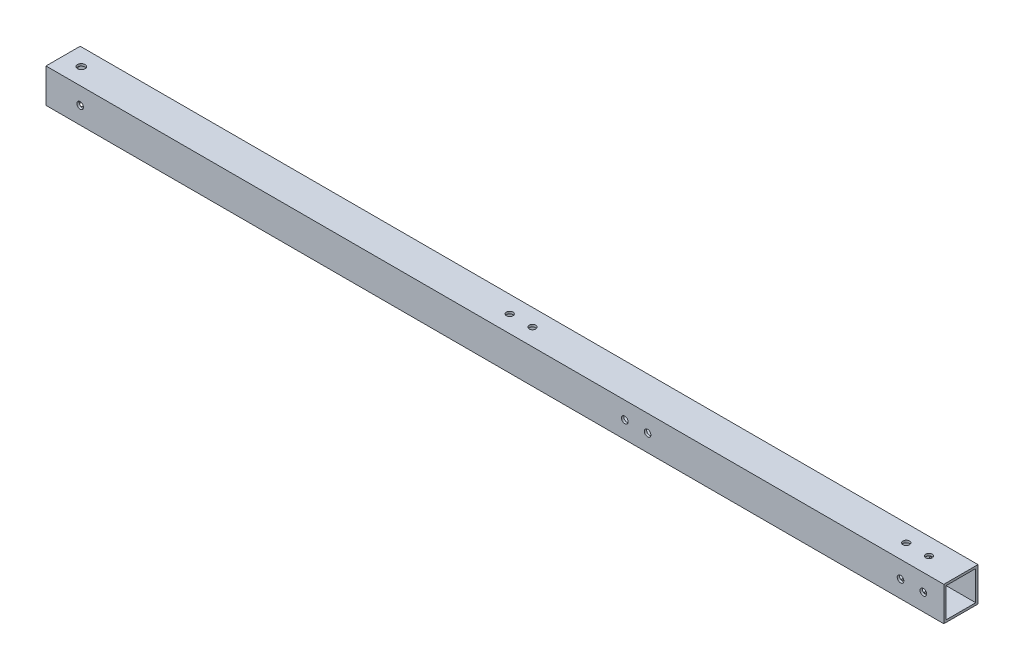
ISO-10303-21;
HEADER;
FILE_DESCRIPTION(('STEP AP214'),'2;1');
FILE_NAME('part.step','',(''),(''),'','','');
FILE_SCHEMA(('AUTOMOTIVE_DESIGN { 1 0 10303 214 1 1 1 1 }'));
ENDSEC;
DATA;
#1=APPLICATION_CONTEXT('core data for automotive mechanical design processes');
#2=APPLICATION_PROTOCOL_DEFINITION('international standard','automotive_design',2000,#1);
#3=PRODUCT_CONTEXT('',#1,'mechanical');
#4=PRODUCT('Part','Part','',(#3));
#5=PRODUCT_RELATED_PRODUCT_CATEGORY('part','',(#4));
#6=PRODUCT_DEFINITION_FORMATION('','',#4);
#7=PRODUCT_DEFINITION_CONTEXT('part definition',#1,'design');
#8=PRODUCT_DEFINITION('design','',#6,#7);
#9=PRODUCT_DEFINITION_SHAPE('','',#8);
#10=(LENGTH_UNIT() NAMED_UNIT(*) SI_UNIT(.MILLI.,.METRE.));
#11=(NAMED_UNIT(*) PLANE_ANGLE_UNIT() SI_UNIT($,.RADIAN.));
#12=(NAMED_UNIT(*) SI_UNIT($,.STERADIAN.) SOLID_ANGLE_UNIT());
#13=UNCERTAINTY_MEASURE_WITH_UNIT(LENGTH_MEASURE(1.E-05),#10,'distance_accuracy_value','');
#14=(GEOMETRIC_REPRESENTATION_CONTEXT(3) GLOBAL_UNCERTAINTY_ASSIGNED_CONTEXT((#13)) GLOBAL_UNIT_ASSIGNED_CONTEXT((#10,
#11,#12)) REPRESENTATION_CONTEXT('',''));
#15=CARTESIAN_POINT('',(0.,0.,0.));
#16=DIRECTION('',(0.,0.,1.));
#17=DIRECTION('',(1.,0.,0.));
#18=AXIS2_PLACEMENT_3D('',#15,#16,#17);
#19=CARTESIAN_POINT('',(394.,0.,0.));
#20=DIRECTION('',(-1.,0.,0.));
#21=DIRECTION('',(0.,0.,1.));
#22=AXIS2_PLACEMENT_3D('',#19,#20,#21);
#23=PLANE('',#22);
#24=DIRECTION('',(0.,1.,0.));
#25=VECTOR('',#24,1.);
#26=CARTESIAN_POINT('',(394.,-7.5,-7.5));
#27=LINE('',#26,#25);
#28=CARTESIAN_POINT('',(394.,-7.5,-7.5));
#29=VERTEX_POINT('',#28);
#30=CARTESIAN_POINT('',(394.,7.5,-7.5));
#31=VERTEX_POINT('',#30);
#32=EDGE_CURVE('E146',#29,#31,#27,.T.);
#33=ORIENTED_EDGE('',*,*,#32,.T.);
#34=DIRECTION('',(0.,0.,1.));
#35=VECTOR('',#34,1.);
#36=CARTESIAN_POINT('',(394.,7.5,7.5));
#37=LINE('',#36,#35);
#38=CARTESIAN_POINT('',(394.,7.5,7.5));
#39=VERTEX_POINT('',#38);
#40=EDGE_CURVE('E149',#31,#39,#37,.T.);
#41=ORIENTED_EDGE('',*,*,#40,.T.);
#42=DIRECTION('',(0.,-1.,0.));
#43=VECTOR('',#42,1.);
#44=CARTESIAN_POINT('',(394.,-7.5,7.5));
#45=LINE('',#44,#43);
#46=CARTESIAN_POINT('',(394.,-7.5,7.5));
#47=VERTEX_POINT('',#46);
#48=EDGE_CURVE('E152',#39,#47,#45,.T.);
#49=ORIENTED_EDGE('',*,*,#48,.T.);
#50=DIRECTION('',(0.,0.,-1.));
#51=VECTOR('',#50,1.);
#52=CARTESIAN_POINT('',(394.,-7.5,7.5));
#53=LINE('',#52,#51);
#54=EDGE_CURVE('E154',#47,#29,#53,.T.);
#55=ORIENTED_EDGE('',*,*,#54,.T.);
#56=EDGE_LOOP('',(#33,#41,#49,#55));
#57=FACE_BOUND('',#56,.T.);
#58=DIRECTION('',(0.,0.,-1.));
#59=VECTOR('',#58,1.);
#60=CARTESIAN_POINT('',(394.,-6.5,6.5));
#61=LINE('',#60,#59);
#62=CARTESIAN_POINT('',(394.,-6.5,6.5));
#63=VERTEX_POINT('',#62);
#64=CARTESIAN_POINT('',(394.,-6.5,-6.5));
#65=VERTEX_POINT('',#64);
#66=EDGE_CURVE('E108',#63,#65,#61,.T.);
#67=ORIENTED_EDGE('',*,*,#66,.F.);
#68=DIRECTION('',(0.,-1.,0.));
#69=VECTOR('',#68,1.);
#70=CARTESIAN_POINT('',(394.,-6.5,6.5));
#71=LINE('',#70,#69);
#72=CARTESIAN_POINT('',(394.,6.5,6.5));
#73=VERTEX_POINT('',#72);
#74=EDGE_CURVE('E130',#73,#63,#71,.T.);
#75=ORIENTED_EDGE('',*,*,#74,.F.);
#76=DIRECTION('',(0.,0.,1.));
#77=VECTOR('',#76,1.);
#78=CARTESIAN_POINT('',(394.,6.5,6.5));
#79=LINE('',#78,#77);
#80=CARTESIAN_POINT('',(394.,6.5,-6.5));
#81=VERTEX_POINT('',#80);
#82=EDGE_CURVE('E128',#81,#73,#79,.T.);
#83=ORIENTED_EDGE('',*,*,#82,.F.);
#84=DIRECTION('',(0.,1.,0.));
#85=VECTOR('',#84,1.);
#86=CARTESIAN_POINT('',(394.,-6.5,-6.5));
#87=LINE('',#86,#85);
#88=EDGE_CURVE('E116',#65,#81,#87,.T.);
#89=ORIENTED_EDGE('',*,*,#88,.F.);
#90=EDGE_LOOP('',(#67,#75,#83,#89));
#91=FACE_BOUND('',#90,.T.);
#92=ADVANCED_FACE('F41',(#57,#91),#23,.F.);
#93=CARTESIAN_POINT('',(0.,0.,0.));
#94=DIRECTION('',(-1.,0.,0.));
#95=DIRECTION('',(0.,0.,1.));
#96=AXIS2_PLACEMENT_3D('',#93,#94,#95);
#97=PLANE('',#96);
#98=DIRECTION('',(0.,1.,0.));
#99=VECTOR('',#98,1.);
#100=CARTESIAN_POINT('',(0.,-7.5,-7.5));
#101=LINE('',#100,#99);
#102=CARTESIAN_POINT('',(0.,-7.5,-7.5));
#103=VERTEX_POINT('',#102);
#104=CARTESIAN_POINT('',(0.,7.5,-7.5));
#105=VERTEX_POINT('',#104);
#106=EDGE_CURVE('E124',#103,#105,#101,.T.);
#107=ORIENTED_EDGE('',*,*,#106,.F.);
#108=DIRECTION('',(0.,0.,-1.));
#109=VECTOR('',#108,1.);
#110=CARTESIAN_POINT('',(0.,-7.5,7.5));
#111=LINE('',#110,#109);
#112=CARTESIAN_POINT('',(0.,-7.5,7.5));
#113=VERTEX_POINT('',#112);
#114=EDGE_CURVE('E150',#113,#103,#111,.T.);
#115=ORIENTED_EDGE('',*,*,#114,.F.);
#116=DIRECTION('',(0.,-1.,0.));
#117=VECTOR('',#116,1.);
#118=CARTESIAN_POINT('',(0.,-7.5,7.5));
#119=LINE('',#118,#117);
#120=CARTESIAN_POINT('',(0.,7.5,7.5));
#121=VERTEX_POINT('',#120);
#122=EDGE_CURVE('E161',#121,#113,#119,.T.);
#123=ORIENTED_EDGE('',*,*,#122,.F.);
#124=DIRECTION('',(0.,0.,1.));
#125=VECTOR('',#124,1.);
#126=CARTESIAN_POINT('',(0.,7.5,7.5));
#127=LINE('',#126,#125);
#128=EDGE_CURVE('E159',#105,#121,#127,.T.);
#129=ORIENTED_EDGE('',*,*,#128,.F.);
#130=EDGE_LOOP('',(#107,#115,#123,#129));
#131=FACE_BOUND('',#130,.T.);
#132=DIRECTION('',(0.,-1.,0.));
#133=VECTOR('',#132,1.);
#134=CARTESIAN_POINT('',(0.,-6.5,6.5));
#135=LINE('',#134,#133);
#136=CARTESIAN_POINT('',(0.,6.5,6.5));
#137=VERTEX_POINT('',#136);
#138=CARTESIAN_POINT('',(0.,-6.5,6.5));
#139=VERTEX_POINT('',#138);
#140=EDGE_CURVE('E117',#137,#139,#135,.T.);
#141=ORIENTED_EDGE('',*,*,#140,.T.);
#142=DIRECTION('',(0.,0.,-1.));
#143=VECTOR('',#142,1.);
#144=CARTESIAN_POINT('',(0.,-6.5,6.5));
#145=LINE('',#144,#143);
#146=CARTESIAN_POINT('',(0.,-6.5,-6.5));
#147=VERTEX_POINT('',#146);
#148=EDGE_CURVE('E66',#139,#147,#145,.T.);
#149=ORIENTED_EDGE('',*,*,#148,.T.);
#150=DIRECTION('',(0.,1.,0.));
#151=VECTOR('',#150,1.);
#152=CARTESIAN_POINT('',(0.,-6.5,-6.5));
#153=LINE('',#152,#151);
#154=CARTESIAN_POINT('',(0.,6.5,-6.5));
#155=VERTEX_POINT('',#154);
#156=EDGE_CURVE('E123',#147,#155,#153,.T.);
#157=ORIENTED_EDGE('',*,*,#156,.T.);
#158=DIRECTION('',(0.,0.,1.));
#159=VECTOR('',#158,1.);
#160=CARTESIAN_POINT('',(0.,6.5,6.5));
#161=LINE('',#160,#159);
#162=EDGE_CURVE('E138',#155,#137,#161,.T.);
#163=ORIENTED_EDGE('',*,*,#162,.T.);
#164=EDGE_LOOP('',(#141,#149,#157,#163));
#165=FACE_BOUND('',#164,.T.);
#166=ADVANCED_FACE('F298',(#131,#165),#97,.T.);
#167=CARTESIAN_POINT('',(394.,-7.5,-7.5));
#168=DIRECTION('',(0.,0.,1.));
#169=DIRECTION('',(1.,0.,0.));
#170=AXIS2_PLACEMENT_3D('',#167,#168,#169);
#171=PLANE('',#170);
#172=CARTESIAN_POINT('',(15.0000000000045,0.,-7.5));
#173=DIRECTION('',(0.,0.,1.));
#174=DIRECTION('',(1.,0.,0.));
#175=AXIS2_PLACEMENT_3D('',#172,#173,#174);
#176=CIRCLE('',#175,1.4499999999957);
#177=CARTESIAN_POINT('',(16.4500000000002,0.,-7.5));
#178=VERTEX_POINT('',#177);
#179=EDGE_CURVE('E414',#178,#178,#176,.T.);
#180=ORIENTED_EDGE('',*,*,#179,.T.);
#181=EDGE_LOOP('',(#180));
#182=FACE_BOUND('',#181,.T.);
#183=CARTESIAN_POINT('',(254.,6.66133814775094E-13,-7.5));
#184=DIRECTION('',(0.,0.,1.));
#185=DIRECTION('',(1.,0.,0.));
#186=AXIS2_PLACEMENT_3D('',#183,#184,#185);
#187=CIRCLE('',#186,1.45000000000084);
#188=CARTESIAN_POINT('',(255.450000000001,6.66133814775094E-13,-7.5));
#189=VERTEX_POINT('',#188);
#190=EDGE_CURVE('E408',#189,#189,#187,.T.);
#191=ORIENTED_EDGE('',*,*,#190,.T.);
#192=EDGE_LOOP('',(#191));
#193=FACE_BOUND('',#192,.T.);
#194=CARTESIAN_POINT('',(264.,5.55111512312578E-13,-7.5));
#195=DIRECTION('',(0.,0.,1.));
#196=DIRECTION('',(1.,0.,0.));
#197=AXIS2_PLACEMENT_3D('',#194,#195,#196);
#198=CIRCLE('',#197,1.45000000000084);
#199=CARTESIAN_POINT('',(265.450000000001,5.55111512312578E-13,-7.5));
#200=VERTEX_POINT('',#199);
#201=EDGE_CURVE('E400',#200,#200,#198,.T.);
#202=ORIENTED_EDGE('',*,*,#201,.T.);
#203=EDGE_LOOP('',(#202));
#204=FACE_BOUND('',#203,.T.);
#205=CARTESIAN_POINT('',(385.,0.,-7.5));
#206=DIRECTION('',(0.,0.,1.));
#207=DIRECTION('',(1.,0.,0.));
#208=AXIS2_PLACEMENT_3D('',#205,#206,#207);
#209=CIRCLE('',#208,1.44999999999994);
#210=CARTESIAN_POINT('',(386.45,0.,-7.5));
#211=VERTEX_POINT('',#210);
#212=EDGE_CURVE('E391',#211,#211,#209,.T.);
#213=ORIENTED_EDGE('',*,*,#212,.T.);
#214=EDGE_LOOP('',(#213));
#215=FACE_BOUND('',#214,.T.);
#216=CARTESIAN_POINT('',(375.,0.,-7.5));
#217=DIRECTION('',(0.,0.,1.));
#218=DIRECTION('',(1.,0.,0.));
#219=AXIS2_PLACEMENT_3D('',#216,#217,#218);
#220=CIRCLE('',#219,1.44999999999994);
#221=CARTESIAN_POINT('',(376.45,0.,-7.5));
#222=VERTEX_POINT('',#221);
#223=EDGE_CURVE('E195',#222,#222,#220,.T.);
#224=ORIENTED_EDGE('',*,*,#223,.T.);
#225=EDGE_LOOP('',(#224));
#226=FACE_BOUND('',#225,.T.);
#227=ORIENTED_EDGE('',*,*,#106,.T.);
#228=DIRECTION('',(-1.,0.,0.));
#229=VECTOR('',#228,1.);
#230=CARTESIAN_POINT('',(394.,7.5,-7.5));
#231=LINE('',#230,#229);
#232=EDGE_CURVE('E11',#31,#105,#231,.T.);
#233=ORIENTED_EDGE('',*,*,#232,.F.);
#234=ORIENTED_EDGE('',*,*,#32,.F.);
#235=DIRECTION('',(-1.,0.,0.));
#236=VECTOR('',#235,1.);
#237=CARTESIAN_POINT('',(394.,-7.5,-7.5));
#238=LINE('',#237,#236);
#239=EDGE_CURVE('E156',#29,#103,#238,.T.);
#240=ORIENTED_EDGE('',*,*,#239,.T.);
#241=EDGE_LOOP('',(#227,#233,#234,#240));
#242=FACE_BOUND('',#241,.T.);
#243=ADVANCED_FACE('F43',(#182,#193,#204,#215,#226,#242),#171,.F.);
#244=CARTESIAN_POINT('',(394.,7.5,7.5));
#245=DIRECTION('',(0.,-1.,0.));
#246=DIRECTION('',(0.,0.,-1.));
#247=AXIS2_PLACEMENT_3D('',#244,#245,#246);
#248=PLANE('',#247);
#249=CARTESIAN_POINT('',(8.00000000000494,7.5,0.));
#250=DIRECTION('',(0.,1.,0.));
#251=DIRECTION('',(0.,0.,1.));
#252=AXIS2_PLACEMENT_3D('',#249,#250,#251);
#253=CIRCLE('',#252,1.65);
#254=CARTESIAN_POINT('',(8.00000000000494,7.5,1.64999999999998));
#255=VERTEX_POINT('',#254);
#256=EDGE_CURVE('E223',#255,#255,#253,.T.);
#257=ORIENTED_EDGE('',*,*,#256,.F.);
#258=EDGE_LOOP('',(#257));
#259=FACE_BOUND('',#258,.T.);
#260=CARTESIAN_POINT('',(380.,7.5,0.));
#261=DIRECTION('',(0.,1.,0.));
#262=DIRECTION('',(0.,0.,1.));
#263=AXIS2_PLACEMENT_3D('',#260,#261,#262);
#264=CIRCLE('',#263,1.45);
#265=CARTESIAN_POINT('',(380.,7.5,1.45));
#266=VERTEX_POINT('',#265);
#267=EDGE_CURVE('E226',#266,#266,#264,.T.);
#268=ORIENTED_EDGE('',*,*,#267,.F.);
#269=EDGE_LOOP('',(#268));
#270=FACE_BOUND('',#269,.T.);
#271=CARTESIAN_POINT('',(370.,7.5,0.));
#272=DIRECTION('',(0.,1.,0.));
#273=DIRECTION('',(0.,0.,1.));
#274=AXIS2_PLACEMENT_3D('',#271,#272,#273);
#275=CIRCLE('',#274,1.45);
#276=CARTESIAN_POINT('',(370.,7.5,1.45));
#277=VERTEX_POINT('',#276);
#278=EDGE_CURVE('E232',#277,#277,#275,.T.);
#279=ORIENTED_EDGE('',*,*,#278,.F.);
#280=EDGE_LOOP('',(#279));
#281=FACE_BOUND('',#280,.T.);
#282=CARTESIAN_POINT('',(196.000000000002,7.5,-1.17961196366423E-11));
#283=DIRECTION('',(0.,1.,0.));
#284=DIRECTION('',(0.,0.,1.));
#285=AXIS2_PLACEMENT_3D('',#282,#283,#284);
#286=CIRCLE('',#285,1.44999999999739);
#287=CARTESIAN_POINT('',(196.000000000002,7.5,1.44999999998559));
#288=VERTEX_POINT('',#287);
#289=EDGE_CURVE('E238',#288,#288,#286,.T.);
#290=ORIENTED_EDGE('',*,*,#289,.F.);
#291=EDGE_LOOP('',(#290));
#292=FACE_BOUND('',#291,.T.);
#293=CARTESIAN_POINT('',(206.000000000002,7.5,-1.14352971536391E-11));
#294=DIRECTION('',(0.,1.,0.));
#295=DIRECTION('',(0.,0.,1.));
#296=AXIS2_PLACEMENT_3D('',#293,#294,#295);
#297=CIRCLE('',#296,1.44999999999739);
#298=CARTESIAN_POINT('',(206.000000000002,7.5,1.44999999998595));
#299=VERTEX_POINT('',#298);
#300=EDGE_CURVE('E244',#299,#299,#297,.T.);
#301=ORIENTED_EDGE('',*,*,#300,.F.);
#302=EDGE_LOOP('',(#301));
#303=FACE_BOUND('',#302,.T.);
#304=ORIENTED_EDGE('',*,*,#128,.T.);
#305=DIRECTION('',(-1.,0.,0.));
#306=VECTOR('',#305,1.);
#307=CARTESIAN_POINT('',(394.,7.5,7.5));
#308=LINE('',#307,#306);
#309=EDGE_CURVE('E50',#39,#121,#308,.T.);
#310=ORIENTED_EDGE('',*,*,#309,.F.);
#311=ORIENTED_EDGE('',*,*,#40,.F.);
#312=ORIENTED_EDGE('',*,*,#232,.T.);
#313=EDGE_LOOP('',(#304,#310,#311,#312));
#314=FACE_BOUND('',#313,.T.);
#315=ADVANCED_FACE('F302',(#259,#270,#281,#292,#303,#314),#248,.F.);
#316=CARTESIAN_POINT('',(394.,-7.5,7.5));
#317=DIRECTION('',(0.,0.,-1.));
#318=DIRECTION('',(-1.,0.,0.));
#319=AXIS2_PLACEMENT_3D('',#316,#317,#318);
#320=PLANE('',#319);
#321=CARTESIAN_POINT('',(15.0000000000045,0.,7.5));
#322=DIRECTION('',(0.,0.,1.));
#323=DIRECTION('',(1.,0.,0.));
#324=AXIS2_PLACEMENT_3D('',#321,#322,#323);
#325=CIRCLE('',#324,1.4499999999957);
#326=CARTESIAN_POINT('',(16.4500000000002,0.,7.5));
#327=VERTEX_POINT('',#326);
#328=EDGE_CURVE('E411',#327,#327,#325,.T.);
#329=ORIENTED_EDGE('',*,*,#328,.F.);
#330=EDGE_LOOP('',(#329));
#331=FACE_BOUND('',#330,.T.);
#332=CARTESIAN_POINT('',(254.,6.66133814775094E-13,7.5));
#333=DIRECTION('',(0.,0.,1.));
#334=DIRECTION('',(1.,0.,0.));
#335=AXIS2_PLACEMENT_3D('',#332,#333,#334);
#336=CIRCLE('',#335,1.45000000000084);
#337=CARTESIAN_POINT('',(255.450000000001,6.66133814775094E-13,7.5));
#338=VERTEX_POINT('',#337);
#339=EDGE_CURVE('E405',#338,#338,#336,.T.);
#340=ORIENTED_EDGE('',*,*,#339,.F.);
#341=EDGE_LOOP('',(#340));
#342=FACE_BOUND('',#341,.T.);
#343=CARTESIAN_POINT('',(264.,5.55111512312578E-13,7.5));
#344=DIRECTION('',(0.,0.,1.));
#345=DIRECTION('',(1.,0.,0.));
#346=AXIS2_PLACEMENT_3D('',#343,#344,#345);
#347=CIRCLE('',#346,1.45000000000084);
#348=CARTESIAN_POINT('',(265.450000000001,5.55111512312578E-13,7.5));
#349=VERTEX_POINT('',#348);
#350=EDGE_CURVE('E394',#349,#349,#347,.T.);
#351=ORIENTED_EDGE('',*,*,#350,.F.);
#352=EDGE_LOOP('',(#351));
#353=FACE_BOUND('',#352,.T.);
#354=CARTESIAN_POINT('',(385.,0.,7.5));
#355=DIRECTION('',(0.,0.,1.));
#356=DIRECTION('',(1.,0.,0.));
#357=AXIS2_PLACEMENT_3D('',#354,#355,#356);
#358=CIRCLE('',#357,1.44999999999994);
#359=CARTESIAN_POINT('',(386.45,0.,7.5));
#360=VERTEX_POINT('',#359);
#361=EDGE_CURVE('E393',#360,#360,#358,.T.);
#362=ORIENTED_EDGE('',*,*,#361,.F.);
#363=EDGE_LOOP('',(#362));
#364=FACE_BOUND('',#363,.T.);
#365=CARTESIAN_POINT('',(375.,0.,7.5));
#366=DIRECTION('',(0.,0.,1.));
#367=DIRECTION('',(1.,0.,0.));
#368=AXIS2_PLACEMENT_3D('',#365,#366,#367);
#369=CIRCLE('',#368,1.44999999999994);
#370=CARTESIAN_POINT('',(376.45,0.,7.5));
#371=VERTEX_POINT('',#370);
#372=EDGE_CURVE('E397',#371,#371,#369,.T.);
#373=ORIENTED_EDGE('',*,*,#372,.F.);
#374=EDGE_LOOP('',(#373));
#375=FACE_BOUND('',#374,.T.);
#376=ORIENTED_EDGE('',*,*,#122,.T.);
#377=DIRECTION('',(-1.,0.,0.));
#378=VECTOR('',#377,1.);
#379=CARTESIAN_POINT('',(394.,-7.5,7.5));
#380=LINE('',#379,#378);
#381=EDGE_CURVE('E166',#47,#113,#380,.T.);
#382=ORIENTED_EDGE('',*,*,#381,.F.);
#383=ORIENTED_EDGE('',*,*,#48,.F.);
#384=ORIENTED_EDGE('',*,*,#309,.T.);
#385=EDGE_LOOP('',(#376,#382,#383,#384));
#386=FACE_BOUND('',#385,.T.);
#387=ADVANCED_FACE('F285',(#331,#342,#353,#364,#375,#386),#320,.F.);
#388=CARTESIAN_POINT('',(394.,-7.5,7.5));
#389=DIRECTION('',(0.,1.,0.));
#390=DIRECTION('',(0.,0.,1.));
#391=AXIS2_PLACEMENT_3D('',#388,#389,#390);
#392=PLANE('',#391);
#393=CARTESIAN_POINT('',(8.00000000000494,-7.5,0.));
#394=DIRECTION('',(0.,1.,0.));
#395=DIRECTION('',(0.,0.,1.));
#396=AXIS2_PLACEMENT_3D('',#393,#394,#395);
#397=CIRCLE('',#396,1.65);
#398=CARTESIAN_POINT('',(8.00000000000494,-7.5,1.64999999999998));
#399=VERTEX_POINT('',#398);
#400=EDGE_CURVE('E175',#399,#399,#397,.T.);
#401=ORIENTED_EDGE('',*,*,#400,.T.);
#402=EDGE_LOOP('',(#401));
#403=FACE_BOUND('',#402,.T.);
#404=CARTESIAN_POINT('',(380.,-7.5,0.));
#405=DIRECTION('',(0.,1.,0.));
#406=DIRECTION('',(0.,0.,1.));
#407=AXIS2_PLACEMENT_3D('',#404,#405,#406);
#408=CIRCLE('',#407,1.45);
#409=CARTESIAN_POINT('',(380.,-7.5,1.45));
#410=VERTEX_POINT('',#409);
#411=EDGE_CURVE('E229',#410,#410,#408,.T.);
#412=ORIENTED_EDGE('',*,*,#411,.T.);
#413=EDGE_LOOP('',(#412));
#414=FACE_BOUND('',#413,.T.);
#415=CARTESIAN_POINT('',(370.,-7.5,0.));
#416=DIRECTION('',(0.,1.,0.));
#417=DIRECTION('',(0.,0.,1.));
#418=AXIS2_PLACEMENT_3D('',#415,#416,#417);
#419=CIRCLE('',#418,1.45);
#420=CARTESIAN_POINT('',(370.,-7.5,1.45));
#421=VERTEX_POINT('',#420);
#422=EDGE_CURVE('E235',#421,#421,#419,.T.);
#423=ORIENTED_EDGE('',*,*,#422,.T.);
#424=EDGE_LOOP('',(#423));
#425=FACE_BOUND('',#424,.T.);
#426=CARTESIAN_POINT('',(196.000000000002,-7.5,-1.17961196366423E-11));
#427=DIRECTION('',(0.,1.,0.));
#428=DIRECTION('',(0.,0.,1.));
#429=AXIS2_PLACEMENT_3D('',#426,#427,#428);
#430=CIRCLE('',#429,1.44999999999739);
#431=CARTESIAN_POINT('',(196.000000000002,-7.5,1.44999999998559));
#432=VERTEX_POINT('',#431);
#433=EDGE_CURVE('E241',#432,#432,#430,.T.);
#434=ORIENTED_EDGE('',*,*,#433,.T.);
#435=EDGE_LOOP('',(#434));
#436=FACE_BOUND('',#435,.T.);
#437=CARTESIAN_POINT('',(206.000000000002,-7.5,-1.14352971536391E-11));
#438=DIRECTION('',(0.,1.,0.));
#439=DIRECTION('',(0.,0.,1.));
#440=AXIS2_PLACEMENT_3D('',#437,#438,#439);
#441=CIRCLE('',#440,1.44999999999739);
#442=CARTESIAN_POINT('',(206.000000000002,-7.5,1.44999999998595));
#443=VERTEX_POINT('',#442);
#444=EDGE_CURVE('E220',#443,#443,#441,.T.);
#445=ORIENTED_EDGE('',*,*,#444,.T.);
#446=EDGE_LOOP('',(#445));
#447=FACE_BOUND('',#446,.T.);
#448=ORIENTED_EDGE('',*,*,#114,.T.);
#449=ORIENTED_EDGE('',*,*,#239,.F.);
#450=ORIENTED_EDGE('',*,*,#54,.F.);
#451=ORIENTED_EDGE('',*,*,#381,.T.);
#452=EDGE_LOOP('',(#448,#449,#450,#451));
#453=FACE_BOUND('',#452,.T.);
#454=ADVANCED_FACE('F264',(#403,#414,#425,#436,#447,#453),#392,.F.);
#455=CARTESIAN_POINT('',(394.,-6.5,6.5));
#456=DIRECTION('',(0.,1.,0.));
#457=DIRECTION('',(0.,0.,1.));
#458=AXIS2_PLACEMENT_3D('',#455,#456,#457);
#459=PLANE('',#458);
#460=CARTESIAN_POINT('',(8.00000000000494,-6.5,0.));
#461=DIRECTION('',(0.,1.,0.));
#462=DIRECTION('',(0.,0.,1.));
#463=AXIS2_PLACEMENT_3D('',#460,#461,#462);
#464=CIRCLE('',#463,1.65);
#465=CARTESIAN_POINT('',(8.00000000000494,-6.5,1.64999999999998));
#466=VERTEX_POINT('',#465);
#467=EDGE_CURVE('E136',#466,#466,#464,.T.);
#468=ORIENTED_EDGE('',*,*,#467,.F.);
#469=EDGE_LOOP('',(#468));
#470=FACE_BOUND('',#469,.T.);
#471=CARTESIAN_POINT('',(380.,-6.5,0.));
#472=DIRECTION('',(0.,1.,0.));
#473=DIRECTION('',(0.,0.,1.));
#474=AXIS2_PLACEMENT_3D('',#471,#472,#473);
#475=CIRCLE('',#474,1.45);
#476=CARTESIAN_POINT('',(380.,-6.5,1.45));
#477=VERTEX_POINT('',#476);
#478=EDGE_CURVE('E187',#477,#477,#475,.T.);
#479=ORIENTED_EDGE('',*,*,#478,.F.);
#480=EDGE_LOOP('',(#479));
#481=FACE_BOUND('',#480,.T.);
#482=CARTESIAN_POINT('',(370.,-6.5,0.));
#483=DIRECTION('',(0.,1.,0.));
#484=DIRECTION('',(0.,0.,1.));
#485=AXIS2_PLACEMENT_3D('',#482,#483,#484);
#486=CIRCLE('',#485,1.45);
#487=CARTESIAN_POINT('',(370.,-6.5,1.45));
#488=VERTEX_POINT('',#487);
#489=EDGE_CURVE('E183',#488,#488,#486,.T.);
#490=ORIENTED_EDGE('',*,*,#489,.F.);
#491=EDGE_LOOP('',(#490));
#492=FACE_BOUND('',#491,.T.);
#493=CARTESIAN_POINT('',(196.000000000002,-6.5,-1.17961196366423E-11));
#494=DIRECTION('',(0.,1.,0.));
#495=DIRECTION('',(0.,0.,1.));
#496=AXIS2_PLACEMENT_3D('',#493,#494,#495);
#497=CIRCLE('',#496,1.44999999999739);
#498=CARTESIAN_POINT('',(196.000000000002,-6.5,1.44999999998559));
#499=VERTEX_POINT('',#498);
#500=EDGE_CURVE('E179',#499,#499,#497,.T.);
#501=ORIENTED_EDGE('',*,*,#500,.F.);
#502=EDGE_LOOP('',(#501));
#503=FACE_BOUND('',#502,.T.);
#504=CARTESIAN_POINT('',(206.000000000002,-6.5,-1.14352971536391E-11));
#505=DIRECTION('',(0.,1.,0.));
#506=DIRECTION('',(0.,0.,1.));
#507=AXIS2_PLACEMENT_3D('',#504,#505,#506);
#508=CIRCLE('',#507,1.44999999999739);
#509=CARTESIAN_POINT('',(206.000000000002,-6.5,1.44999999998595));
#510=VERTEX_POINT('',#509);
#511=EDGE_CURVE('E174',#510,#510,#508,.T.);
#512=ORIENTED_EDGE('',*,*,#511,.F.);
#513=EDGE_LOOP('',(#512));
#514=FACE_BOUND('',#513,.T.);
#515=ORIENTED_EDGE('',*,*,#148,.F.);
#516=DIRECTION('',(-1.,0.,0.));
#517=VECTOR('',#516,1.);
#518=CARTESIAN_POINT('',(394.,-6.5,6.5));
#519=LINE('',#518,#517);
#520=EDGE_CURVE('E112',#63,#139,#519,.T.);
#521=ORIENTED_EDGE('',*,*,#520,.F.);
#522=ORIENTED_EDGE('',*,*,#66,.T.);
#523=DIRECTION('',(-1.,0.,0.));
#524=VECTOR('',#523,1.);
#525=CARTESIAN_POINT('',(394.,-6.5,-6.5));
#526=LINE('',#525,#524);
#527=EDGE_CURVE('E111',#65,#147,#526,.T.);
#528=ORIENTED_EDGE('',*,*,#527,.T.);
#529=EDGE_LOOP('',(#515,#521,#522,#528));
#530=FACE_BOUND('',#529,.T.);
#531=ADVANCED_FACE('F110',(#470,#481,#492,#503,#514,#530),#459,.T.);
#532=CARTESIAN_POINT('',(394.,-6.5,-6.5));
#533=DIRECTION('',(0.,0.,1.));
#534=DIRECTION('',(0.,-1.,0.));
#535=AXIS2_PLACEMENT_3D('',#532,#533,#534);
#536=PLANE('',#535);
#537=CARTESIAN_POINT('',(15.0000000000045,0.,-6.5));
#538=DIRECTION('',(0.,0.,1.));
#539=DIRECTION('',(0.,-1.,0.));
#540=AXIS2_PLACEMENT_3D('',#537,#538,#539);
#541=CIRCLE('',#540,1.4499999999957);
#542=CARTESIAN_POINT('',(15.0000000000045,-1.4499999999957,-6.5));
#543=VERTEX_POINT('',#542);
#544=EDGE_CURVE('E217',#543,#543,#541,.T.);
#545=ORIENTED_EDGE('',*,*,#544,.F.);
#546=EDGE_LOOP('',(#545));
#547=FACE_BOUND('',#546,.T.);
#548=CARTESIAN_POINT('',(254.,6.66133814775094E-13,-6.5));
#549=DIRECTION('',(0.,0.,1.));
#550=DIRECTION('',(0.,-1.,0.));
#551=AXIS2_PLACEMENT_3D('',#548,#549,#550);
#552=CIRCLE('',#551,1.45000000000084);
#553=CARTESIAN_POINT('',(254.,-1.45000000000017,-6.5));
#554=VERTEX_POINT('',#553);
#555=EDGE_CURVE('E205',#554,#554,#552,.T.);
#556=ORIENTED_EDGE('',*,*,#555,.F.);
#557=EDGE_LOOP('',(#556));
#558=FACE_BOUND('',#557,.T.);
#559=CARTESIAN_POINT('',(264.,5.55111512312578E-13,-6.5));
#560=DIRECTION('',(0.,0.,1.));
#561=DIRECTION('',(0.,-1.,0.));
#562=AXIS2_PLACEMENT_3D('',#559,#560,#561);
#563=CIRCLE('',#562,1.45000000000084);
#564=CARTESIAN_POINT('',(264.,-1.45000000000028,-6.5));
#565=VERTEX_POINT('',#564);
#566=EDGE_CURVE('E202',#565,#565,#563,.T.);
#567=ORIENTED_EDGE('',*,*,#566,.F.);
#568=EDGE_LOOP('',(#567));
#569=FACE_BOUND('',#568,.T.);
#570=CARTESIAN_POINT('',(385.,0.,-6.5));
#571=DIRECTION('',(0.,0.,1.));
#572=DIRECTION('',(0.,-1.,0.));
#573=AXIS2_PLACEMENT_3D('',#570,#571,#572);
#574=CIRCLE('',#573,1.44999999999994);
#575=CARTESIAN_POINT('',(385.,-1.44999999999993,-6.5));
#576=VERTEX_POINT('',#575);
#577=EDGE_CURVE('E199',#576,#576,#574,.T.);
#578=ORIENTED_EDGE('',*,*,#577,.F.);
#579=EDGE_LOOP('',(#578));
#580=FACE_BOUND('',#579,.T.);
#581=CARTESIAN_POINT('',(375.,0.,-6.5));
#582=DIRECTION('',(0.,0.,1.));
#583=DIRECTION('',(0.,-1.,0.));
#584=AXIS2_PLACEMENT_3D('',#581,#582,#583);
#585=CIRCLE('',#584,1.44999999999994);
#586=CARTESIAN_POINT('',(375.,-1.44999999999993,-6.5));
#587=VERTEX_POINT('',#586);
#588=EDGE_CURVE('E194',#587,#587,#585,.T.);
#589=ORIENTED_EDGE('',*,*,#588,.F.);
#590=EDGE_LOOP('',(#589));
#591=FACE_BOUND('',#590,.T.);
#592=ORIENTED_EDGE('',*,*,#156,.F.);
#593=ORIENTED_EDGE('',*,*,#527,.F.);
#594=ORIENTED_EDGE('',*,*,#88,.T.);
#595=DIRECTION('',(-1.,0.,0.));
#596=VECTOR('',#595,1.);
#597=CARTESIAN_POINT('',(394.,6.5,-6.5));
#598=LINE('',#597,#596);
#599=EDGE_CURVE('E125',#81,#155,#598,.T.);
#600=ORIENTED_EDGE('',*,*,#599,.T.);
#601=EDGE_LOOP('',(#592,#593,#594,#600));
#602=FACE_BOUND('',#601,.T.);
#603=ADVANCED_FACE('F120',(#547,#558,#569,#580,#591,#602),#536,.T.);
#604=CARTESIAN_POINT('',(394.,6.5,6.5));
#605=DIRECTION('',(0.,-1.,0.));
#606=DIRECTION('',(0.,0.,-1.));
#607=AXIS2_PLACEMENT_3D('',#604,#605,#606);
#608=PLANE('',#607);
#609=CARTESIAN_POINT('',(8.00000000000494,6.5,0.));
#610=DIRECTION('',(0.,-1.,0.));
#611=DIRECTION('',(0.,0.,-1.));
#612=AXIS2_PLACEMENT_3D('',#609,#610,#611);
#613=CIRCLE('',#612,1.65);
#614=CARTESIAN_POINT('',(8.00000000000494,6.5,-1.65000000000002));
#615=VERTEX_POINT('',#614);
#616=EDGE_CURVE('E188',#615,#615,#613,.T.);
#617=ORIENTED_EDGE('',*,*,#616,.F.);
#618=EDGE_LOOP('',(#617));
#619=FACE_BOUND('',#618,.T.);
#620=CARTESIAN_POINT('',(380.,6.5,0.));
#621=DIRECTION('',(0.,-1.,0.));
#622=DIRECTION('',(0.,0.,-1.));
#623=AXIS2_PLACEMENT_3D('',#620,#621,#622);
#624=CIRCLE('',#623,1.45);
#625=CARTESIAN_POINT('',(380.,6.5,-1.45));
#626=VERTEX_POINT('',#625);
#627=EDGE_CURVE('E184',#626,#626,#624,.T.);
#628=ORIENTED_EDGE('',*,*,#627,.F.);
#629=EDGE_LOOP('',(#628));
#630=FACE_BOUND('',#629,.T.);
#631=CARTESIAN_POINT('',(370.,6.5,0.));
#632=DIRECTION('',(0.,-1.,0.));
#633=DIRECTION('',(0.,0.,-1.));
#634=AXIS2_PLACEMENT_3D('',#631,#632,#633);
#635=CIRCLE('',#634,1.45);
#636=CARTESIAN_POINT('',(370.,6.5,-1.45));
#637=VERTEX_POINT('',#636);
#638=EDGE_CURVE('E180',#637,#637,#635,.T.);
#639=ORIENTED_EDGE('',*,*,#638,.F.);
#640=EDGE_LOOP('',(#639));
#641=FACE_BOUND('',#640,.T.);
#642=CARTESIAN_POINT('',(196.000000000002,6.5,-1.17961196366423E-11));
#643=DIRECTION('',(0.,-1.,0.));
#644=DIRECTION('',(0.,0.,-1.));
#645=AXIS2_PLACEMENT_3D('',#642,#643,#644);
#646=CIRCLE('',#645,1.44999999999739);
#647=CARTESIAN_POINT('',(196.000000000002,6.5,-1.45000000000918));
#648=VERTEX_POINT('',#647);
#649=EDGE_CURVE('E176',#648,#648,#646,.T.);
#650=ORIENTED_EDGE('',*,*,#649,.F.);
#651=EDGE_LOOP('',(#650));
#652=FACE_BOUND('',#651,.T.);
#653=CARTESIAN_POINT('',(206.000000000002,6.5,-1.14352971536391E-11));
#654=DIRECTION('',(0.,-1.,0.));
#655=DIRECTION('',(0.,0.,-1.));
#656=AXIS2_PLACEMENT_3D('',#653,#654,#655);
#657=CIRCLE('',#656,1.44999999999739);
#658=CARTESIAN_POINT('',(206.000000000002,6.5,-1.45000000000882));
#659=VERTEX_POINT('',#658);
#660=EDGE_CURVE('E171',#659,#659,#657,.T.);
#661=ORIENTED_EDGE('',*,*,#660,.F.);
#662=EDGE_LOOP('',(#661));
#663=FACE_BOUND('',#662,.T.);
#664=ORIENTED_EDGE('',*,*,#162,.F.);
#665=ORIENTED_EDGE('',*,*,#599,.F.);
#666=ORIENTED_EDGE('',*,*,#82,.T.);
#667=DIRECTION('',(-1.,0.,0.));
#668=VECTOR('',#667,1.);
#669=CARTESIAN_POINT('',(394.,6.5,6.5));
#670=LINE('',#669,#668);
#671=EDGE_CURVE('E58',#73,#137,#670,.T.);
#672=ORIENTED_EDGE('',*,*,#671,.T.);
#673=EDGE_LOOP('',(#664,#665,#666,#672));
#674=FACE_BOUND('',#673,.T.);
#675=ADVANCED_FACE('F325',(#619,#630,#641,#652,#663,#674),#608,.T.);
#676=CARTESIAN_POINT('',(394.,-6.5,6.5));
#677=DIRECTION('',(0.,0.,-1.));
#678=DIRECTION('',(-1.,0.,0.));
#679=AXIS2_PLACEMENT_3D('',#676,#677,#678);
#680=PLANE('',#679);
#681=CARTESIAN_POINT('',(15.0000000000045,0.,6.5));
#682=DIRECTION('',(0.,0.,-1.));
#683=DIRECTION('',(-1.,0.,0.));
#684=AXIS2_PLACEMENT_3D('',#681,#682,#683);
#685=CIRCLE('',#684,1.4499999999957);
#686=CARTESIAN_POINT('',(13.5500000000088,0.,6.5));
#687=VERTEX_POINT('',#686);
#688=EDGE_CURVE('E45',#687,#687,#685,.T.);
#689=ORIENTED_EDGE('',*,*,#688,.F.);
#690=EDGE_LOOP('',(#689));
#691=FACE_BOUND('',#690,.T.);
#692=CARTESIAN_POINT('',(254.,6.66133814775094E-13,6.5));
#693=DIRECTION('',(0.,0.,-1.));
#694=DIRECTION('',(-1.,0.,0.));
#695=AXIS2_PLACEMENT_3D('',#692,#693,#694);
#696=CIRCLE('',#695,1.45000000000084);
#697=CARTESIAN_POINT('',(252.55,6.66133814775094E-13,6.5));
#698=VERTEX_POINT('',#697);
#699=EDGE_CURVE('E203',#698,#698,#696,.T.);
#700=ORIENTED_EDGE('',*,*,#699,.F.);
#701=EDGE_LOOP('',(#700));
#702=FACE_BOUND('',#701,.T.);
#703=CARTESIAN_POINT('',(264.,5.55111512312578E-13,6.5));
#704=DIRECTION('',(0.,0.,-1.));
#705=DIRECTION('',(-1.,0.,0.));
#706=AXIS2_PLACEMENT_3D('',#703,#704,#705);
#707=CIRCLE('',#706,1.45000000000084);
#708=CARTESIAN_POINT('',(262.55,5.55111512312578E-13,6.5));
#709=VERTEX_POINT('',#708);
#710=EDGE_CURVE('E200',#709,#709,#707,.T.);
#711=ORIENTED_EDGE('',*,*,#710,.F.);
#712=EDGE_LOOP('',(#711));
#713=FACE_BOUND('',#712,.T.);
#714=CARTESIAN_POINT('',(385.,0.,6.5));
#715=DIRECTION('',(0.,0.,-1.));
#716=DIRECTION('',(-1.,0.,0.));
#717=AXIS2_PLACEMENT_3D('',#714,#715,#716);
#718=CIRCLE('',#717,1.44999999999994);
#719=CARTESIAN_POINT('',(383.55,0.,6.5));
#720=VERTEX_POINT('',#719);
#721=EDGE_CURVE('E196',#720,#720,#718,.T.);
#722=ORIENTED_EDGE('',*,*,#721,.F.);
#723=EDGE_LOOP('',(#722));
#724=FACE_BOUND('',#723,.T.);
#725=CARTESIAN_POINT('',(375.,0.,6.5));
#726=DIRECTION('',(0.,0.,-1.));
#727=DIRECTION('',(-1.,0.,0.));
#728=AXIS2_PLACEMENT_3D('',#725,#726,#727);
#729=CIRCLE('',#728,1.44999999999994);
#730=CARTESIAN_POINT('',(373.55,0.,6.5));
#731=VERTEX_POINT('',#730);
#732=EDGE_CURVE('E191',#731,#731,#729,.T.);
#733=ORIENTED_EDGE('',*,*,#732,.F.);
#734=EDGE_LOOP('',(#733));
#735=FACE_BOUND('',#734,.T.);
#736=ORIENTED_EDGE('',*,*,#140,.F.);
#737=ORIENTED_EDGE('',*,*,#671,.F.);
#738=ORIENTED_EDGE('',*,*,#74,.T.);
#739=ORIENTED_EDGE('',*,*,#520,.T.);
#740=EDGE_LOOP('',(#736,#737,#738,#739));
#741=FACE_BOUND('',#740,.T.);
#742=ADVANCED_FACE('F329',(#691,#702,#713,#724,#735,#741),#680,.T.);
#743=CARTESIAN_POINT('',(206.000000000002,-7.5,-1.14352971536391E-11));
#744=DIRECTION('',(0.,1.,0.));
#745=DIRECTION('',(0.,0.,1.));
#746=AXIS2_PLACEMENT_3D('',#743,#744,#745);
#747=CYLINDRICAL_SURFACE('',#746,1.44999999999739);
#748=ORIENTED_EDGE('',*,*,#660,.T.);
#749=EDGE_LOOP('',(#748));
#750=FACE_BOUND('',#749,.T.);
#751=ORIENTED_EDGE('',*,*,#300,.T.);
#752=EDGE_LOOP('',(#751));
#753=FACE_BOUND('',#752,.T.);
#754=ADVANCED_FACE('F280',(#750,#753),#747,.F.);
#755=CARTESIAN_POINT('',(196.000000000002,-7.5,-1.17961196366423E-11));
#756=DIRECTION('',(0.,1.,0.));
#757=DIRECTION('',(0.,0.,1.));
#758=AXIS2_PLACEMENT_3D('',#755,#756,#757);
#759=CYLINDRICAL_SURFACE('',#758,1.44999999999739);
#760=ORIENTED_EDGE('',*,*,#649,.T.);
#761=EDGE_LOOP('',(#760));
#762=FACE_BOUND('',#761,.T.);
#763=ORIENTED_EDGE('',*,*,#289,.T.);
#764=EDGE_LOOP('',(#763));
#765=FACE_BOUND('',#764,.T.);
#766=ADVANCED_FACE('F335',(#762,#765),#759,.F.);
#767=CARTESIAN_POINT('',(370.,-7.5,0.));
#768=DIRECTION('',(0.,1.,0.));
#769=DIRECTION('',(0.,0.,1.));
#770=AXIS2_PLACEMENT_3D('',#767,#768,#769);
#771=CYLINDRICAL_SURFACE('',#770,1.45);
#772=ORIENTED_EDGE('',*,*,#638,.T.);
#773=EDGE_LOOP('',(#772));
#774=FACE_BOUND('',#773,.T.);
#775=ORIENTED_EDGE('',*,*,#278,.T.);
#776=EDGE_LOOP('',(#775));
#777=FACE_BOUND('',#776,.T.);
#778=ADVANCED_FACE('F339',(#774,#777),#771,.F.);
#779=CARTESIAN_POINT('',(380.,-7.5,0.));
#780=DIRECTION('',(0.,1.,0.));
#781=DIRECTION('',(0.,0.,1.));
#782=AXIS2_PLACEMENT_3D('',#779,#780,#781);
#783=CYLINDRICAL_SURFACE('',#782,1.45);
#784=ORIENTED_EDGE('',*,*,#627,.T.);
#785=EDGE_LOOP('',(#784));
#786=FACE_BOUND('',#785,.T.);
#787=ORIENTED_EDGE('',*,*,#267,.T.);
#788=EDGE_LOOP('',(#787));
#789=FACE_BOUND('',#788,.T.);
#790=ADVANCED_FACE('F343',(#786,#789),#783,.F.);
#791=CARTESIAN_POINT('',(8.00000000000494,-7.5,0.));
#792=DIRECTION('',(0.,1.,0.));
#793=DIRECTION('',(0.,0.,1.));
#794=AXIS2_PLACEMENT_3D('',#791,#792,#793);
#795=CYLINDRICAL_SURFACE('',#794,1.65);
#796=ORIENTED_EDGE('',*,*,#616,.T.);
#797=EDGE_LOOP('',(#796));
#798=FACE_BOUND('',#797,.T.);
#799=ORIENTED_EDGE('',*,*,#256,.T.);
#800=EDGE_LOOP('',(#799));
#801=FACE_BOUND('',#800,.T.);
#802=ADVANCED_FACE('F278',(#798,#801),#795,.F.);
#803=ORIENTED_EDGE('',*,*,#511,.T.);
#804=EDGE_LOOP('',(#803));
#805=FACE_BOUND('',#804,.T.);
#806=ORIENTED_EDGE('',*,*,#444,.F.);
#807=EDGE_LOOP('',(#806));
#808=FACE_BOUND('',#807,.T.);
#809=ADVANCED_FACE('F274',(#805,#808),#747,.F.);
#810=ORIENTED_EDGE('',*,*,#500,.T.);
#811=EDGE_LOOP('',(#810));
#812=FACE_BOUND('',#811,.T.);
#813=ORIENTED_EDGE('',*,*,#433,.F.);
#814=EDGE_LOOP('',(#813));
#815=FACE_BOUND('',#814,.T.);
#816=ADVANCED_FACE('F277',(#812,#815),#759,.F.);
#817=ORIENTED_EDGE('',*,*,#489,.T.);
#818=EDGE_LOOP('',(#817));
#819=FACE_BOUND('',#818,.T.);
#820=ORIENTED_EDGE('',*,*,#422,.F.);
#821=EDGE_LOOP('',(#820));
#822=FACE_BOUND('',#821,.T.);
#823=ADVANCED_FACE('F345',(#819,#822),#771,.F.);
#824=ORIENTED_EDGE('',*,*,#478,.T.);
#825=EDGE_LOOP('',(#824));
#826=FACE_BOUND('',#825,.T.);
#827=ORIENTED_EDGE('',*,*,#411,.F.);
#828=EDGE_LOOP('',(#827));
#829=FACE_BOUND('',#828,.T.);
#830=ADVANCED_FACE('F349',(#826,#829),#783,.F.);
#831=ORIENTED_EDGE('',*,*,#467,.T.);
#832=EDGE_LOOP('',(#831));
#833=FACE_BOUND('',#832,.T.);
#834=ORIENTED_EDGE('',*,*,#400,.F.);
#835=EDGE_LOOP('',(#834));
#836=FACE_BOUND('',#835,.T.);
#837=ADVANCED_FACE('F259',(#833,#836),#795,.F.);
#838=CARTESIAN_POINT('',(375.,0.,-7.5));
#839=DIRECTION('',(0.,0.,1.));
#840=DIRECTION('',(1.,0.,0.));
#841=AXIS2_PLACEMENT_3D('',#838,#839,#840);
#842=CYLINDRICAL_SURFACE('',#841,1.44999999999994);
#843=ORIENTED_EDGE('',*,*,#732,.T.);
#844=EDGE_LOOP('',(#843));
#845=FACE_BOUND('',#844,.T.);
#846=ORIENTED_EDGE('',*,*,#372,.T.);
#847=EDGE_LOOP('',(#846));
#848=FACE_BOUND('',#847,.T.);
#849=ADVANCED_FACE('F353',(#845,#848),#842,.F.);
#850=CARTESIAN_POINT('',(385.,0.,-7.5));
#851=DIRECTION('',(0.,0.,1.));
#852=DIRECTION('',(1.,0.,0.));
#853=AXIS2_PLACEMENT_3D('',#850,#851,#852);
#854=CYLINDRICAL_SURFACE('',#853,1.44999999999994);
#855=ORIENTED_EDGE('',*,*,#721,.T.);
#856=EDGE_LOOP('',(#855));
#857=FACE_BOUND('',#856,.T.);
#858=ORIENTED_EDGE('',*,*,#361,.T.);
#859=EDGE_LOOP('',(#858));
#860=FACE_BOUND('',#859,.T.);
#861=ADVANCED_FACE('F356',(#857,#860),#854,.F.);
#862=CARTESIAN_POINT('',(264.,5.55111512312578E-13,-7.5));
#863=DIRECTION('',(0.,0.,1.));
#864=DIRECTION('',(1.,0.,0.));
#865=AXIS2_PLACEMENT_3D('',#862,#863,#864);
#866=CYLINDRICAL_SURFACE('',#865,1.45000000000084);
#867=ORIENTED_EDGE('',*,*,#710,.T.);
#868=EDGE_LOOP('',(#867));
#869=FACE_BOUND('',#868,.T.);
#870=ORIENTED_EDGE('',*,*,#350,.T.);
#871=EDGE_LOOP('',(#870));
#872=FACE_BOUND('',#871,.T.);
#873=ADVANCED_FACE('F367',(#869,#872),#866,.F.);
#874=CARTESIAN_POINT('',(254.,6.66133814775094E-13,-7.5));
#875=DIRECTION('',(0.,0.,1.));
#876=DIRECTION('',(1.,0.,0.));
#877=AXIS2_PLACEMENT_3D('',#874,#875,#876);
#878=CYLINDRICAL_SURFACE('',#877,1.45000000000084);
#879=ORIENTED_EDGE('',*,*,#699,.T.);
#880=EDGE_LOOP('',(#879));
#881=FACE_BOUND('',#880,.T.);
#882=ORIENTED_EDGE('',*,*,#339,.T.);
#883=EDGE_LOOP('',(#882));
#884=FACE_BOUND('',#883,.T.);
#885=ADVANCED_FACE('F362',(#881,#884),#878,.F.);
#886=CARTESIAN_POINT('',(15.0000000000045,0.,-7.5));
#887=DIRECTION('',(0.,0.,1.));
#888=DIRECTION('',(1.,0.,0.));
#889=AXIS2_PLACEMENT_3D('',#886,#887,#888);
#890=CYLINDRICAL_SURFACE('',#889,1.4499999999957);
#891=ORIENTED_EDGE('',*,*,#688,.T.);
#892=EDGE_LOOP('',(#891));
#893=FACE_BOUND('',#892,.T.);
#894=ORIENTED_EDGE('',*,*,#328,.T.);
#895=EDGE_LOOP('',(#894));
#896=FACE_BOUND('',#895,.T.);
#897=ADVANCED_FACE('F359',(#893,#896),#890,.F.);
#898=ORIENTED_EDGE('',*,*,#588,.T.);
#899=EDGE_LOOP('',(#898));
#900=FACE_BOUND('',#899,.T.);
#901=ORIENTED_EDGE('',*,*,#223,.F.);
#902=EDGE_LOOP('',(#901));
#903=FACE_BOUND('',#902,.T.);
#904=ADVANCED_FACE('F358',(#900,#903),#842,.F.);
#905=ORIENTED_EDGE('',*,*,#577,.T.);
#906=EDGE_LOOP('',(#905));
#907=FACE_BOUND('',#906,.T.);
#908=ORIENTED_EDGE('',*,*,#212,.F.);
#909=EDGE_LOOP('',(#908));
#910=FACE_BOUND('',#909,.T.);
#911=ADVANCED_FACE('F375',(#907,#910),#854,.F.);
#912=ORIENTED_EDGE('',*,*,#566,.T.);
#913=EDGE_LOOP('',(#912));
#914=FACE_BOUND('',#913,.T.);
#915=ORIENTED_EDGE('',*,*,#201,.F.);
#916=EDGE_LOOP('',(#915));
#917=FACE_BOUND('',#916,.T.);
#918=ADVANCED_FACE('F372',(#914,#917),#866,.F.);
#919=ORIENTED_EDGE('',*,*,#555,.T.);
#920=EDGE_LOOP('',(#919));
#921=FACE_BOUND('',#920,.T.);
#922=ORIENTED_EDGE('',*,*,#190,.F.);
#923=EDGE_LOOP('',(#922));
#924=FACE_BOUND('',#923,.T.);
#925=ADVANCED_FACE('F368',(#921,#924),#878,.F.);
#926=ORIENTED_EDGE('',*,*,#544,.T.);
#927=EDGE_LOOP('',(#926));
#928=FACE_BOUND('',#927,.T.);
#929=ORIENTED_EDGE('',*,*,#179,.F.);
#930=EDGE_LOOP('',(#929));
#931=FACE_BOUND('',#930,.T.);
#932=ADVANCED_FACE('F364',(#928,#931),#890,.F.);
#933=CLOSED_SHELL('',(#92,#166,#243,#315,#387,#454,#531,#603,#675,#742,#754,#766,#778,#790,#802,
#809,#816,#823,#830,#837,#849,#861,#873,#885,#897,#904,#911,#918,#925,#932));
#934=MANIFOLD_SOLID_BREP('B2',#933);
#935=ADVANCED_BREP_SHAPE_REPRESENTATION('',(#18,#934),#14);
#936=SHAPE_DEFINITION_REPRESENTATION(#9,#935);
ENDSEC;
END-ISO-10303-21;
